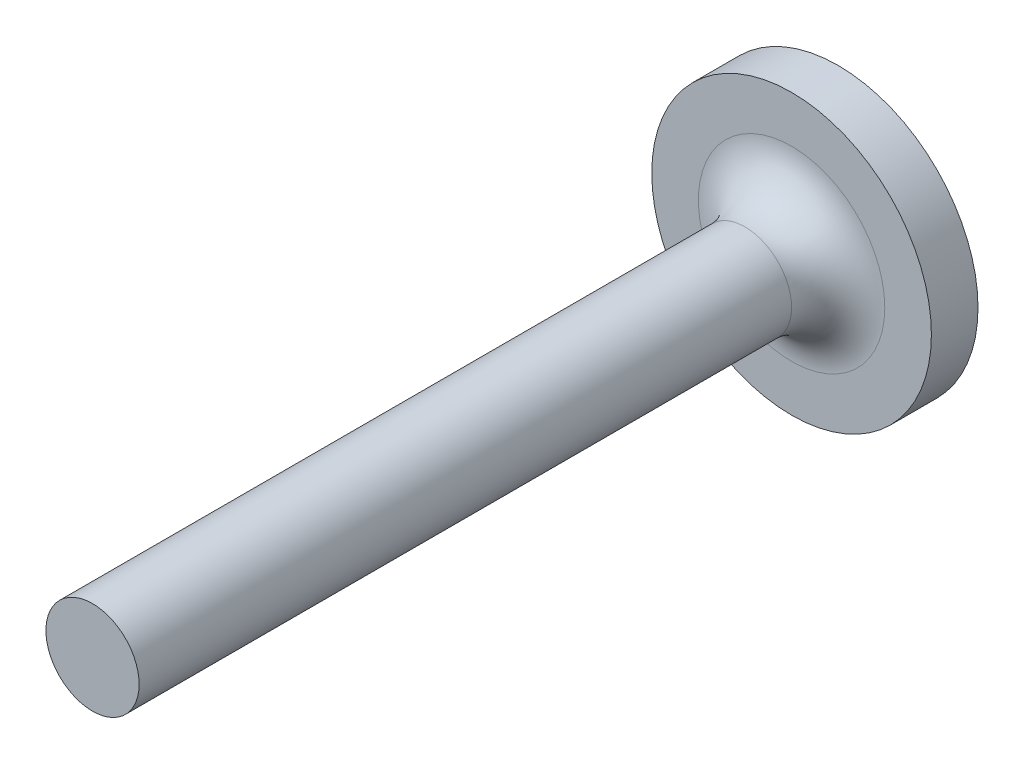
ISO-10303-21;
HEADER;
FILE_DESCRIPTION(('STEP AP214'),'2;1');
FILE_NAME('part.step','',(''),(''),'','','');
FILE_SCHEMA(('AUTOMOTIVE_DESIGN { 1 0 10303 214 1 1 1 1 }'));
ENDSEC;
DATA;
#1=APPLICATION_CONTEXT('core data for automotive mechanical design processes');
#2=APPLICATION_PROTOCOL_DEFINITION('international standard','automotive_design',2000,#1);
#3=PRODUCT_CONTEXT('',#1,'mechanical');
#4=PRODUCT('Part','Part','',(#3));
#5=PRODUCT_RELATED_PRODUCT_CATEGORY('part','',(#4));
#6=PRODUCT_DEFINITION_FORMATION('','',#4);
#7=PRODUCT_DEFINITION_CONTEXT('part definition',#1,'design');
#8=PRODUCT_DEFINITION('design','',#6,#7);
#9=PRODUCT_DEFINITION_SHAPE('','',#8);
#10=(LENGTH_UNIT() NAMED_UNIT(*) SI_UNIT(.MILLI.,.METRE.));
#11=(NAMED_UNIT(*) PLANE_ANGLE_UNIT() SI_UNIT($,.RADIAN.));
#12=(NAMED_UNIT(*) SI_UNIT($,.STERADIAN.) SOLID_ANGLE_UNIT());
#13=UNCERTAINTY_MEASURE_WITH_UNIT(LENGTH_MEASURE(1.E-05),#10,'distance_accuracy_value','');
#14=(GEOMETRIC_REPRESENTATION_CONTEXT(3) GLOBAL_UNCERTAINTY_ASSIGNED_CONTEXT((#13)) GLOBAL_UNIT_ASSIGNED_CONTEXT((#10,
#11,#12)) REPRESENTATION_CONTEXT('',''));
#15=CARTESIAN_POINT('',(0.,0.,0.));
#16=DIRECTION('',(0.,0.,1.));
#17=DIRECTION('',(1.,0.,0.));
#18=AXIS2_PLACEMENT_3D('',#15,#16,#17);
#19=CARTESIAN_POINT('',(0.,0.,37.));
#20=DIRECTION('',(0.,0.,-1.));
#21=DIRECTION('',(-1.,0.,0.));
#22=AXIS2_PLACEMENT_3D('',#19,#20,#21);
#23=CYLINDRICAL_SURFACE('',#22,2.);
#24=CARTESIAN_POINT('',(0.,0.,4.));
#25=DIRECTION('',(0.,0.,1.));
#26=DIRECTION('',(1.,0.,0.));
#27=AXIS2_PLACEMENT_3D('',#24,#25,#26);
#28=CIRCLE('',#27,2.);
#29=CARTESIAN_POINT('',(2.,0.,4.));
#30=VERTEX_POINT('',#29);
#31=EDGE_CURVE('E46',#30,#30,#28,.T.);
#32=ORIENTED_EDGE('',*,*,#31,.T.);
#33=EDGE_LOOP('',(#32));
#34=FACE_BOUND('',#33,.T.);
#35=CARTESIAN_POINT('',(0.,0.,32.));
#36=DIRECTION('',(0.,0.,1.));
#37=DIRECTION('',(1.,0.,0.));
#38=AXIS2_PLACEMENT_3D('',#35,#36,#37);
#39=CIRCLE('',#38,2.);
#40=CARTESIAN_POINT('',(2.,0.,32.));
#41=VERTEX_POINT('',#40);
#42=EDGE_CURVE('E58',#41,#41,#39,.T.);
#43=ORIENTED_EDGE('',*,*,#42,.F.);
#44=EDGE_LOOP('',(#43));
#45=FACE_BOUND('',#44,.T.);
#46=ADVANCED_FACE('F39',(#34,#45),#23,.T.);
#47=CARTESIAN_POINT('',(0.,0.,2.));
#48=DIRECTION('',(0.,0.,-1.));
#49=DIRECTION('',(-1.,0.,0.));
#50=AXIS2_PLACEMENT_3D('',#47,#48,#49);
#51=CYLINDRICAL_SURFACE('',#50,6.);
#52=CARTESIAN_POINT('',(0.,0.,2.));
#53=DIRECTION('',(0.,0.,1.));
#54=DIRECTION('',(1.,0.,0.));
#55=AXIS2_PLACEMENT_3D('',#52,#53,#54);
#56=CIRCLE('',#55,6.);
#57=CARTESIAN_POINT('',(6.,0.,2.));
#58=VERTEX_POINT('',#57);
#59=EDGE_CURVE('E50',#58,#58,#56,.T.);
#60=ORIENTED_EDGE('',*,*,#59,.F.);
#61=EDGE_LOOP('',(#60));
#62=FACE_BOUND('',#61,.T.);
#63=CARTESIAN_POINT('',(0.,0.,0.));
#64=DIRECTION('',(0.,0.,1.));
#65=DIRECTION('',(1.,0.,0.));
#66=AXIS2_PLACEMENT_3D('',#63,#64,#65);
#67=CIRCLE('',#66,6.);
#68=CARTESIAN_POINT('',(6.,0.,0.));
#69=VERTEX_POINT('',#68);
#70=EDGE_CURVE('E54',#69,#69,#67,.T.);
#71=ORIENTED_EDGE('',*,*,#70,.T.);
#72=EDGE_LOOP('',(#71));
#73=FACE_BOUND('',#72,.T.);
#74=ADVANCED_FACE('F66',(#62,#73),#51,.T.);
#75=CARTESIAN_POINT('',(0.,0.,2.));
#76=DIRECTION('',(0.,0.,1.));
#77=DIRECTION('',(1.,0.,0.));
#78=AXIS2_PLACEMENT_3D('',#75,#76,#77);
#79=PLANE('',#78);
#80=CARTESIAN_POINT('',(0.,0.,2.));
#81=DIRECTION('',(0.,0.,1.));
#82=DIRECTION('',(1.,0.,0.));
#83=AXIS2_PLACEMENT_3D('',#80,#81,#82);
#84=CIRCLE('',#83,4.);
#85=CARTESIAN_POINT('',(4.,0.,2.));
#86=VERTEX_POINT('',#85);
#87=EDGE_CURVE('E10',#86,#86,#84,.F.);
#88=ORIENTED_EDGE('',*,*,#87,.T.);
#89=EDGE_LOOP('',(#88));
#90=FACE_BOUND('',#89,.T.);
#91=ORIENTED_EDGE('',*,*,#59,.T.);
#92=EDGE_LOOP('',(#91));
#93=FACE_BOUND('',#92,.T.);
#94=ADVANCED_FACE('F73',(#90,#93),#79,.T.);
#95=CARTESIAN_POINT('',(0.,0.,0.));
#96=DIRECTION('',(0.,0.,1.));
#97=DIRECTION('',(1.,0.,0.));
#98=AXIS2_PLACEMENT_3D('',#95,#96,#97);
#99=PLANE('',#98);
#100=ORIENTED_EDGE('',*,*,#70,.F.);
#101=EDGE_LOOP('',(#100));
#102=FACE_BOUND('',#101,.T.);
#103=ADVANCED_FACE('F79',(#102),#99,.F.);
#104=CARTESIAN_POINT('',(0.,0.,4.));
#105=DIRECTION('',(0.,0.,1.));
#106=DIRECTION('',(1.,0.,0.));
#107=AXIS2_PLACEMENT_3D('',#104,#105,#106);
#108=TOROIDAL_SURFACE('',#107,4.,2.);
#109=ORIENTED_EDGE('',*,*,#87,.F.);
#110=EDGE_LOOP('',(#109));
#111=FACE_BOUND('',#110,.T.);
#112=ORIENTED_EDGE('',*,*,#31,.F.);
#113=EDGE_LOOP('',(#112));
#114=FACE_BOUND('',#113,.T.);
#115=ADVANCED_FACE('F41',(#111,#114),#108,.F.);
#116=CARTESIAN_POINT('',(0.,0.,32.));
#117=DIRECTION('',(0.,0.,1.));
#118=DIRECTION('',(1.,0.,0.));
#119=AXIS2_PLACEMENT_3D('',#116,#117,#118);
#120=PLANE('',#119);
#121=ORIENTED_EDGE('',*,*,#42,.T.);
#122=EDGE_LOOP('',(#121));
#123=FACE_BOUND('',#122,.T.);
#124=ADVANCED_FACE('F63',(#123),#120,.T.);
#125=CLOSED_SHELL('',(#46,#74,#94,#103,#115,#124));
#126=MANIFOLD_SOLID_BREP('B2',#125);
#127=ADVANCED_BREP_SHAPE_REPRESENTATION('',(#18,#126),#14);
#128=SHAPE_DEFINITION_REPRESENTATION(#9,#127);
ENDSEC;
END-ISO-10303-21;
